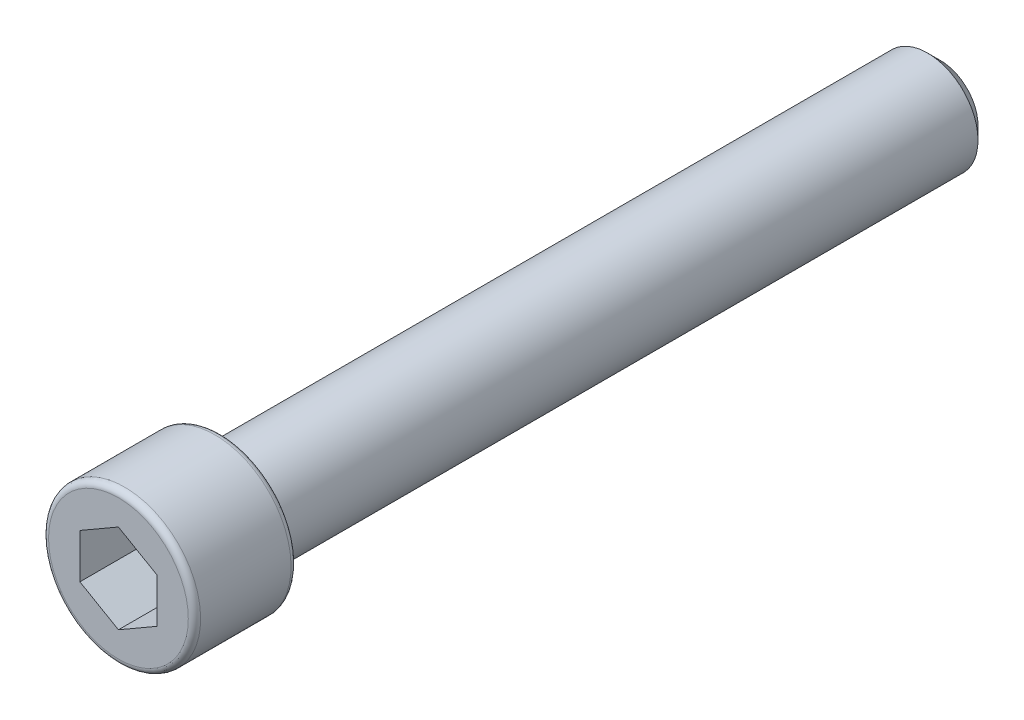
ISO-10303-21;
HEADER;
FILE_DESCRIPTION(('STEP AP214'),'2;1');
FILE_NAME('part.step','',(''),(''),'','','');
FILE_SCHEMA(('AUTOMOTIVE_DESIGN { 1 0 10303 214 1 1 1 1 }'));
ENDSEC;
DATA;
#1=APPLICATION_CONTEXT('core data for automotive mechanical design processes');
#2=APPLICATION_PROTOCOL_DEFINITION('international standard','automotive_design',2000,#1);
#3=PRODUCT_CONTEXT('',#1,'mechanical');
#4=PRODUCT('Part','Part','',(#3));
#5=PRODUCT_RELATED_PRODUCT_CATEGORY('part','',(#4));
#6=PRODUCT_DEFINITION_FORMATION('','',#4);
#7=PRODUCT_DEFINITION_CONTEXT('part definition',#1,'design');
#8=PRODUCT_DEFINITION('design','',#6,#7);
#9=PRODUCT_DEFINITION_SHAPE('','',#8);
#10=(LENGTH_UNIT() NAMED_UNIT(*) SI_UNIT(.MILLI.,.METRE.));
#11=(NAMED_UNIT(*) PLANE_ANGLE_UNIT() SI_UNIT($,.RADIAN.));
#12=(NAMED_UNIT(*) SI_UNIT($,.STERADIAN.) SOLID_ANGLE_UNIT());
#13=UNCERTAINTY_MEASURE_WITH_UNIT(LENGTH_MEASURE(1.E-05),#10,'distance_accuracy_value','');
#14=(GEOMETRIC_REPRESENTATION_CONTEXT(3) GLOBAL_UNCERTAINTY_ASSIGNED_CONTEXT((#13)) GLOBAL_UNIT_ASSIGNED_CONTEXT((#10,
#11,#12)) REPRESENTATION_CONTEXT('',''));
#15=CARTESIAN_POINT('',(0.,0.,0.));
#16=DIRECTION('',(0.,0.,1.));
#17=DIRECTION('',(1.,0.,0.));
#18=AXIS2_PLACEMENT_3D('',#15,#16,#17);
#19=CARTESIAN_POINT('',(0.,0.,2.54));
#20=DIRECTION('',(0.,0.,1.));
#21=DIRECTION('',(1.,0.,0.));
#22=AXIS2_PLACEMENT_3D('',#19,#20,#21);
#23=PLANE('',#22);
#24=DIRECTION('',(0.866025403784468,0.499999999999949,0.));
#25=VECTOR('',#24,1.);
#26=CARTESIAN_POINT('',(-1.190625,2.06222299276167,2.54));
#27=LINE('',#26,#25);
#28=CARTESIAN_POINT('',(-2.38125,1.37481532850786,2.54));
#29=VERTEX_POINT('',#28);
#30=CARTESIAN_POINT('',(0.,2.74963065701547,2.54));
#31=VERTEX_POINT('',#30);
#32=EDGE_CURVE('E97',#29,#31,#27,.T.);
#33=ORIENTED_EDGE('',*,*,#32,.F.);
#34=DIRECTION('',(0.,1.,0.));
#35=VECTOR('',#34,1.);
#36=CARTESIAN_POINT('',(-2.38125,0.,2.54));
#37=LINE('',#36,#35);
#38=CARTESIAN_POINT('',(-2.38125,-1.37481532850786,2.54));
#39=VERTEX_POINT('',#38);
#40=EDGE_CURVE('E81',#39,#29,#37,.T.);
#41=ORIENTED_EDGE('',*,*,#40,.F.);
#42=DIRECTION('',(-0.866025403784468,0.499999999999949,0.));
#43=VECTOR('',#42,1.);
#44=CARTESIAN_POINT('',(-1.190625,-2.06222299276167,2.54));
#45=LINE('',#44,#43);
#46=CARTESIAN_POINT('',(0.,-2.74963065701547,2.54));
#47=VERTEX_POINT('',#46);
#48=EDGE_CURVE('E86',#47,#39,#45,.T.);
#49=ORIENTED_EDGE('',*,*,#48,.F.);
#50=DIRECTION('',(-0.866025403784468,-0.499999999999949,0.));
#51=VECTOR('',#50,1.);
#52=CARTESIAN_POINT('',(1.190625,-2.06222299276167,2.54));
#53=LINE('',#52,#51);
#54=CARTESIAN_POINT('',(2.38125,-1.37481532850786,2.54));
#55=VERTEX_POINT('',#54);
#56=EDGE_CURVE('E180',#55,#47,#53,.T.);
#57=ORIENTED_EDGE('',*,*,#56,.F.);
#58=DIRECTION('',(0.,1.,0.));
#59=VECTOR('',#58,1.);
#60=CARTESIAN_POINT('',(2.38125,0.,2.54));
#61=LINE('',#60,#59);
#62=CARTESIAN_POINT('',(2.38125,1.37481532850786,2.54));
#63=VERTEX_POINT('',#62);
#64=EDGE_CURVE('E185',#63,#55,#61,.F.);
#65=ORIENTED_EDGE('',*,*,#64,.F.);
#66=DIRECTION('',(0.866025403784468,-0.499999999999949,0.));
#67=VECTOR('',#66,1.);
#68=CARTESIAN_POINT('',(1.190625,2.06222299276167,2.54));
#69=LINE('',#68,#67);
#70=EDGE_CURVE('E190',#31,#63,#69,.T.);
#71=ORIENTED_EDGE('',*,*,#70,.F.);
#72=EDGE_LOOP('',(#33,#41,#49,#57,#65,#71));
#73=FACE_BOUND('',#72,.T.);
#74=ADVANCED_FACE('F17',(#73),#23,.T.);
#75=CARTESIAN_POINT('',(-1.190625,-2.06222299276167,4.445));
#76=DIRECTION('',(0.499999999999949,0.866025403784468,0.));
#77=DIRECTION('',(-0.866025403784468,0.499999999999949,0.));
#78=AXIS2_PLACEMENT_3D('',#75,#76,#77);
#79=PLANE('',#78);
#80=ORIENTED_EDGE('',*,*,#48,.T.);
#81=DIRECTION('',(0.,0.,-1.));
#82=VECTOR('',#81,1.);
#83=CARTESIAN_POINT('',(-2.38125,-1.37481532850786,4.445));
#84=LINE('',#83,#82);
#85=CARTESIAN_POINT('',(-2.38125,-1.37481532850786,6.35));
#86=VERTEX_POINT('',#85);
#87=EDGE_CURVE('E88',#86,#39,#84,.T.);
#88=ORIENTED_EDGE('',*,*,#87,.F.);
#89=DIRECTION('',(-0.866025403784468,0.499999999999949,0.));
#90=VECTOR('',#89,1.);
#91=CARTESIAN_POINT('',(0.,-2.74963065701547,6.35));
#92=LINE('',#91,#90);
#93=CARTESIAN_POINT('',(0.,-2.74963065701547,6.35));
#94=VERTEX_POINT('',#93);
#95=EDGE_CURVE('E179',#94,#86,#92,.T.);
#96=ORIENTED_EDGE('',*,*,#95,.F.);
#97=DIRECTION('',(0.,0.,1.));
#98=VECTOR('',#97,1.);
#99=CARTESIAN_POINT('',(0.,-2.74963065701547,4.445));
#100=LINE('',#99,#98);
#101=EDGE_CURVE('E91',#47,#94,#100,.T.);
#102=ORIENTED_EDGE('',*,*,#101,.F.);
#103=EDGE_LOOP('',(#80,#88,#96,#102));
#104=FACE_BOUND('',#103,.T.);
#105=ADVANCED_FACE('F87',(#104),#79,.T.);
#106=CARTESIAN_POINT('',(-2.38125,0.,4.445));
#107=DIRECTION('',(1.,0.,0.));
#108=DIRECTION('',(0.,0.,-1.));
#109=AXIS2_PLACEMENT_3D('',#106,#107,#108);
#110=PLANE('',#109);
#111=ORIENTED_EDGE('',*,*,#40,.T.);
#112=DIRECTION('',(0.,0.,1.));
#113=VECTOR('',#112,1.);
#114=CARTESIAN_POINT('',(-2.38125,1.37481532850786,4.445));
#115=LINE('',#114,#113);
#116=CARTESIAN_POINT('',(-2.38125,1.37481532850786,6.35));
#117=VERTEX_POINT('',#116);
#118=EDGE_CURVE('E99',#117,#29,#115,.F.);
#119=ORIENTED_EDGE('',*,*,#118,.F.);
#120=DIRECTION('',(0.,1.,0.));
#121=VECTOR('',#120,1.);
#122=CARTESIAN_POINT('',(-2.38125,0.,6.35));
#123=LINE('',#122,#121);
#124=EDGE_CURVE('E103',#86,#117,#123,.T.);
#125=ORIENTED_EDGE('',*,*,#124,.F.);
#126=ORIENTED_EDGE('',*,*,#87,.T.);
#127=EDGE_LOOP('',(#111,#119,#125,#126));
#128=FACE_BOUND('',#127,.T.);
#129=ADVANCED_FACE('F101',(#128),#110,.T.);
#130=CARTESIAN_POINT('',(-1.190625,2.06222299276167,4.445));
#131=DIRECTION('',(0.499999999999949,-0.866025403784468,0.));
#132=DIRECTION('',(0.866025403784468,0.499999999999949,0.));
#133=AXIS2_PLACEMENT_3D('',#130,#131,#132);
#134=PLANE('',#133);
#135=ORIENTED_EDGE('',*,*,#32,.T.);
#136=DIRECTION('',(0.,0.,1.));
#137=VECTOR('',#136,1.);
#138=CARTESIAN_POINT('',(0.,2.74963065701547,4.445));
#139=LINE('',#138,#137);
#140=CARTESIAN_POINT('',(0.,2.74963065701547,6.35));
#141=VERTEX_POINT('',#140);
#142=EDGE_CURVE('E192',#141,#31,#139,.F.);
#143=ORIENTED_EDGE('',*,*,#142,.F.);
#144=DIRECTION('',(0.866025403784468,0.499999999999949,0.));
#145=VECTOR('',#144,1.);
#146=CARTESIAN_POINT('',(-2.38125,1.37481532850786,6.35));
#147=LINE('',#146,#145);
#148=EDGE_CURVE('E199',#117,#141,#147,.T.);
#149=ORIENTED_EDGE('',*,*,#148,.F.);
#150=ORIENTED_EDGE('',*,*,#118,.T.);
#151=EDGE_LOOP('',(#135,#143,#149,#150));
#152=FACE_BOUND('',#151,.T.);
#153=ADVANCED_FACE('F197',(#152),#134,.T.);
#154=CARTESIAN_POINT('',(1.190625,2.06222299276167,4.445));
#155=DIRECTION('',(-0.499999999999949,-0.866025403784468,0.));
#156=DIRECTION('',(0.866025403784468,-0.499999999999949,0.));
#157=AXIS2_PLACEMENT_3D('',#154,#155,#156);
#158=PLANE('',#157);
#159=ORIENTED_EDGE('',*,*,#70,.T.);
#160=DIRECTION('',(0.,0.,1.));
#161=VECTOR('',#160,1.);
#162=CARTESIAN_POINT('',(2.38125,1.37481532850786,4.445));
#163=LINE('',#162,#161);
#164=CARTESIAN_POINT('',(2.38125,1.37481532850786,6.35));
#165=VERTEX_POINT('',#164);
#166=EDGE_CURVE('E187',#165,#63,#163,.F.);
#167=ORIENTED_EDGE('',*,*,#166,.F.);
#168=DIRECTION('',(0.866025403784468,-0.499999999999949,0.));
#169=VECTOR('',#168,1.);
#170=CARTESIAN_POINT('',(0.,2.74963065701547,6.35));
#171=LINE('',#170,#169);
#172=EDGE_CURVE('E203',#141,#165,#171,.T.);
#173=ORIENTED_EDGE('',*,*,#172,.F.);
#174=ORIENTED_EDGE('',*,*,#142,.T.);
#175=EDGE_LOOP('',(#159,#167,#173,#174));
#176=FACE_BOUND('',#175,.T.);
#177=ADVANCED_FACE('F349',(#176),#158,.T.);
#178=CARTESIAN_POINT('',(2.38125,0.,4.445));
#179=DIRECTION('',(-1.,0.,0.));
#180=DIRECTION('',(0.,0.,1.));
#181=AXIS2_PLACEMENT_3D('',#178,#179,#180);
#182=PLANE('',#181);
#183=ORIENTED_EDGE('',*,*,#64,.T.);
#184=DIRECTION('',(0.,0.,1.));
#185=VECTOR('',#184,1.);
#186=CARTESIAN_POINT('',(2.38125,-1.37481532850786,4.445));
#187=LINE('',#186,#185);
#188=CARTESIAN_POINT('',(2.38125,-1.37481532850786,6.35));
#189=VERTEX_POINT('',#188);
#190=EDGE_CURVE('E182',#189,#55,#187,.F.);
#191=ORIENTED_EDGE('',*,*,#190,.F.);
#192=DIRECTION('',(0.,1.,0.));
#193=VECTOR('',#192,1.);
#194=CARTESIAN_POINT('',(2.38125,0.,6.35));
#195=LINE('',#194,#193);
#196=EDGE_CURVE('E211',#165,#189,#195,.F.);
#197=ORIENTED_EDGE('',*,*,#196,.F.);
#198=ORIENTED_EDGE('',*,*,#166,.T.);
#199=EDGE_LOOP('',(#183,#191,#197,#198));
#200=FACE_BOUND('',#199,.T.);
#201=ADVANCED_FACE('F342',(#200),#182,.T.);
#202=CARTESIAN_POINT('',(1.190625,-2.06222299276167,4.445));
#203=DIRECTION('',(-0.499999999999949,0.866025403784468,0.));
#204=DIRECTION('',(-0.866025403784468,-0.499999999999949,0.));
#205=AXIS2_PLACEMENT_3D('',#202,#203,#204);
#206=PLANE('',#205);
#207=ORIENTED_EDGE('',*,*,#56,.T.);
#208=ORIENTED_EDGE('',*,*,#101,.T.);
#209=DIRECTION('',(-0.866025403784468,-0.499999999999949,0.));
#210=VECTOR('',#209,1.);
#211=CARTESIAN_POINT('',(2.38125,-1.37481532850786,6.35));
#212=LINE('',#211,#210);
#213=EDGE_CURVE('E213',#189,#94,#212,.T.);
#214=ORIENTED_EDGE('',*,*,#213,.F.);
#215=ORIENTED_EDGE('',*,*,#190,.T.);
#216=EDGE_LOOP('',(#207,#208,#214,#215));
#217=FACE_BOUND('',#216,.T.);
#218=ADVANCED_FACE('F336',(#217),#206,.T.);
#219=CARTESIAN_POINT('',(0.,0.,6.35));
#220=DIRECTION('',(0.,0.,1.));
#221=DIRECTION('',(1.,0.,0.));
#222=AXIS2_PLACEMENT_3D('',#219,#220,#221);
#223=PLANE('',#222);
#224=ORIENTED_EDGE('',*,*,#196,.T.);
#225=ORIENTED_EDGE('',*,*,#213,.T.);
#226=ORIENTED_EDGE('',*,*,#95,.T.);
#227=ORIENTED_EDGE('',*,*,#124,.T.);
#228=ORIENTED_EDGE('',*,*,#148,.T.);
#229=ORIENTED_EDGE('',*,*,#172,.T.);
#230=EDGE_LOOP('',(#224,#225,#226,#227,#228,#229));
#231=FACE_BOUND('',#230,.T.);
#232=CARTESIAN_POINT('',(0.,-1.22456028899995E-13,6.34999999999913));
#233=DIRECTION('',(0.,1.975631E-13,-1.));
#234=DIRECTION('',(0.,1.,1.97657237188637E-13));
#235=AXIS2_PLACEMENT_3D('',#232,#233,#234);
#236=CIRCLE('',#235,4.31800000000028);
#237=CARTESIAN_POINT('',(0.,4.31800000000006,6.34999999999999));
#238=VERTEX_POINT('',#237);
#239=CARTESIAN_POINT('',(-1.16342897463594E-13,-4.31800000000014,6.34999999999897));
#240=VERTEX_POINT('',#239);
#241=EDGE_CURVE('E151',#238,#240,#236,.T.);
#242=ORIENTED_EDGE('',*,*,#241,.F.);
#243=CARTESIAN_POINT('',(0.,-1.22456028899995E-13,6.34999999999913));
#244=DIRECTION('',(0.,1.975631E-13,-1.));
#245=DIRECTION('',(0.,-1.,-1.97657237188656E-13));
#246=AXIS2_PLACEMENT_3D('',#243,#244,#245);
#247=CIRCLE('',#246,4.31799999999987);
#248=EDGE_CURVE('E215',#240,#238,#247,.T.);
#249=ORIENTED_EDGE('',*,*,#248,.F.);
#250=EDGE_LOOP('',(#242,#249));
#251=FACE_BOUND('',#250,.T.);
#252=ADVANCED_FACE('F161',(#231,#251),#223,.T.);
#253=CARTESIAN_POINT('',(0.,0.,5.96899999999916));
#254=DIRECTION('',(0.,1.975631E-13,-1.));
#255=DIRECTION('',(0.,-1.,-1.975631E-13));
#256=AXIS2_PLACEMENT_3D('',#253,#254,#255);
#257=TOROIDAL_SURFACE('',#256,4.31800000000007,0.380999999999975);
#258=ORIENTED_EDGE('',*,*,#248,.T.);
#259=ORIENTED_EDGE('',*,*,#241,.T.);
#260=EDGE_LOOP('',(#258,#259));
#261=FACE_BOUND('',#260,.T.);
#262=CARTESIAN_POINT('',(0.,0.,5.96899999999916));
#263=DIRECTION('',(0.,0.,-1.));
#264=DIRECTION('',(-1.,0.,0.));
#265=AXIS2_PLACEMENT_3D('',#262,#263,#264);
#266=CIRCLE('',#265,4.699);
#267=CARTESIAN_POINT('',(-4.699,0.,5.96899999999916));
#268=VERTEX_POINT('',#267);
#269=EDGE_CURVE('E148',#268,#268,#266,.T.);
#270=ORIENTED_EDGE('',*,*,#269,.F.);
#271=EDGE_LOOP('',(#270));
#272=FACE_BOUND('',#271,.T.);
#273=ADVANCED_FACE('F156',(#261,#272),#257,.T.);
#274=CARTESIAN_POINT('',(0.,0.,5.18668));
#275=DIRECTION('',(0.,0.,-1.));
#276=DIRECTION('',(-1.,0.,0.));
#277=AXIS2_PLACEMENT_3D('',#274,#275,#276);
#278=CYLINDRICAL_SURFACE('',#277,4.699);
#279=ORIENTED_EDGE('',*,*,#269,.T.);
#280=EDGE_LOOP('',(#279));
#281=FACE_BOUND('',#280,.T.);
#282=CARTESIAN_POINT('',(3.93296394E-13,2.333133764E-12,0.380999999998426));
#283=DIRECTION('',(0.,3.8308E-13,-1.));
#284=DIRECTION('',(0.,-1.,-3.83081691206333E-13));
#285=AXIS2_PLACEMENT_3D('',#282,#283,#284);
#286=CIRCLE('',#285,4.69899999999772);
#287=CARTESIAN_POINT('',(3.95310442727799E-13,-4.69899999999538,0.380999999996625));
#288=VERTEX_POINT('',#287);
#289=EDGE_CURVE('E112',#288,#288,#286,.T.);
#290=ORIENTED_EDGE('',*,*,#289,.F.);
#291=EDGE_LOOP('',(#290));
#292=FACE_BOUND('',#291,.T.);
#293=ADVANCED_FACE('F160',(#281,#292),#278,.T.);
#294=CARTESIAN_POINT('',(0.,0.,-44.45));
#295=DIRECTION('',(0.,0.,-1.));
#296=DIRECTION('',(-1.,0.,0.));
#297=AXIS2_PLACEMENT_3D('',#294,#295,#296);
#298=PLANE('',#297);
#299=CARTESIAN_POINT('',(0.,0.,-44.4500000004382));
#300=DIRECTION('',(0.,0.,1.));
#301=DIRECTION('',(1.,0.,0.));
#302=AXIS2_PLACEMENT_3D('',#299,#300,#301);
#303=CIRCLE('',#302,2.31775000031574);
#304=CARTESIAN_POINT('',(2.31775000031574,0.,-44.4500000004382));
#305=VERTEX_POINT('',#304);
#306=EDGE_CURVE('E108',#305,#305,#303,.T.);
#307=ORIENTED_EDGE('',*,*,#306,.F.);
#308=EDGE_LOOP('',(#307));
#309=FACE_BOUND('',#308,.T.);
#310=ADVANCED_FACE('F129',(#309),#298,.T.);
#311=CARTESIAN_POINT('',(3.93296394E-13,2.333133764E-12,0.380999999998425));
#312=DIRECTION('',(0.,3.8308E-13,-1.));
#313=DIRECTION('',(0.,-1.,-3.8308E-13));
#314=AXIS2_PLACEMENT_3D('',#311,#312,#313);
#315=TOROIDAL_SURFACE('',#314,4.31799999999761,0.381000000000101);
#316=ORIENTED_EDGE('',*,*,#289,.T.);
#317=EDGE_LOOP('',(#316));
#318=FACE_BOUND('',#317,.T.);
#319=CARTESIAN_POINT('',(4.14904279410006E-13,2.47908724400004E-12,-1.67595971822809E-12));
#320=DIRECTION('',(0.,-3.8308E-13,1.));
#321=DIRECTION('',(0.,-1.,-3.8307388708972E-13));
#322=AXIS2_PLACEMENT_3D('',#319,#320,#321);
#323=CIRCLE('',#322,4.31799999999765);
#324=CARTESIAN_POINT('',(4.03558975002772E-13,4.31800000000007,0.));
#325=VERTEX_POINT('',#324);
#326=CARTESIAN_POINT('',(4.12466110057247E-13,-4.31799999999517,-1.99804365760836E-12));
#327=VERTEX_POINT('',#326);
#328=EDGE_CURVE('E36',#325,#327,#323,.F.);
#329=ORIENTED_EDGE('',*,*,#328,.F.);
#330=CARTESIAN_POINT('',(4.14904279410006E-13,2.47908724400004E-12,-1.67595971822809E-12));
#331=DIRECTION('',(0.,-3.8308E-13,1.));
#332=DIRECTION('',(0.,1.,3.83073887089726E-13));
#333=AXIS2_PLACEMENT_3D('',#330,#331,#332);
#334=CIRCLE('',#333,4.31799999999758);
#335=EDGE_CURVE('E111',#327,#325,#334,.F.);
#336=ORIENTED_EDGE('',*,*,#335,.F.);
#337=EDGE_LOOP('',(#329,#336));
#338=FACE_BOUND('',#337,.T.);
#339=ADVANCED_FACE('F117',(#318,#338),#315,.T.);
#340=CARTESIAN_POINT('',(0.,0.,-43.6562500000832));
#341=DIRECTION('',(0.,0.,1.));
#342=DIRECTION('',(1.,0.,0.));
#343=AXIS2_PLACEMENT_3D('',#340,#341,#342);
#344=CONICAL_SURFACE('',#343,3.11149999924963,0.785398162502276);
#345=CARTESIAN_POINT('',(0.,0.,-43.65625));
#346=DIRECTION('',(0.,0.,1.));
#347=DIRECTION('',(1.,0.,0.));
#348=AXIS2_PLACEMENT_3D('',#345,#346,#347);
#349=CIRCLE('',#348,3.1115);
#350=CARTESIAN_POINT('',(3.1115,0.,-43.65625));
#351=VERTEX_POINT('',#350);
#352=EDGE_CURVE('E28',#351,#351,#349,.T.);
#353=ORIENTED_EDGE('',*,*,#352,.F.);
#354=EDGE_LOOP('',(#353));
#355=FACE_BOUND('',#354,.T.);
#356=ORIENTED_EDGE('',*,*,#306,.T.);
#357=EDGE_LOOP('',(#356));
#358=FACE_BOUND('',#357,.T.);
#359=ADVANCED_FACE('F128',(#355,#358),#344,.T.);
#360=CARTESIAN_POINT('',(0.,0.,0.));
#361=DIRECTION('',(0.,0.,-1.));
#362=DIRECTION('',(-1.,0.,0.));
#363=AXIS2_PLACEMENT_3D('',#360,#361,#362);
#364=PLANE('',#363);
#365=CARTESIAN_POINT('',(0.,0.,0.));
#366=DIRECTION('',(0.,0.,1.));
#367=DIRECTION('',(1.,0.,0.));
#368=AXIS2_PLACEMENT_3D('',#365,#366,#367);
#369=CIRCLE('',#368,3.1115);
#370=CARTESIAN_POINT('',(3.1115,0.,0.));
#371=VERTEX_POINT('',#370);
#372=EDGE_CURVE('E11',#371,#371,#369,.F.);
#373=ORIENTED_EDGE('',*,*,#372,.F.);
#374=EDGE_LOOP('',(#373));
#375=FACE_BOUND('',#374,.T.);
#376=ORIENTED_EDGE('',*,*,#335,.T.);
#377=ORIENTED_EDGE('',*,*,#328,.T.);
#378=EDGE_LOOP('',(#376,#377));
#379=FACE_BOUND('',#378,.T.);
#380=ADVANCED_FACE('F244',(#375,#379),#364,.T.);
#381=CARTESIAN_POINT('',(0.,0.,-40.64));
#382=DIRECTION('',(0.,0.,1.));
#383=DIRECTION('',(1.,0.,0.));
#384=AXIS2_PLACEMENT_3D('',#381,#382,#383);
#385=CYLINDRICAL_SURFACE('',#384,3.1115);
#386=ORIENTED_EDGE('',*,*,#372,.T.);
#387=EDGE_LOOP('',(#386));
#388=FACE_BOUND('',#387,.T.);
#389=ORIENTED_EDGE('',*,*,#352,.T.);
#390=EDGE_LOOP('',(#389));
#391=FACE_BOUND('',#390,.T.);
#392=ADVANCED_FACE('F242',(#388,#391),#385,.T.);
#393=CLOSED_SHELL('',(#74,#105,#129,#153,#177,#201,#218,#252,#273,#293,#310,#339,#359,#380,#392));
#394=MANIFOLD_SOLID_BREP('B1',#393);
#395=ADVANCED_BREP_SHAPE_REPRESENTATION('',(#18,#394),#14);
#396=SHAPE_DEFINITION_REPRESENTATION(#9,#395);
ENDSEC;
END-ISO-10303-21;
